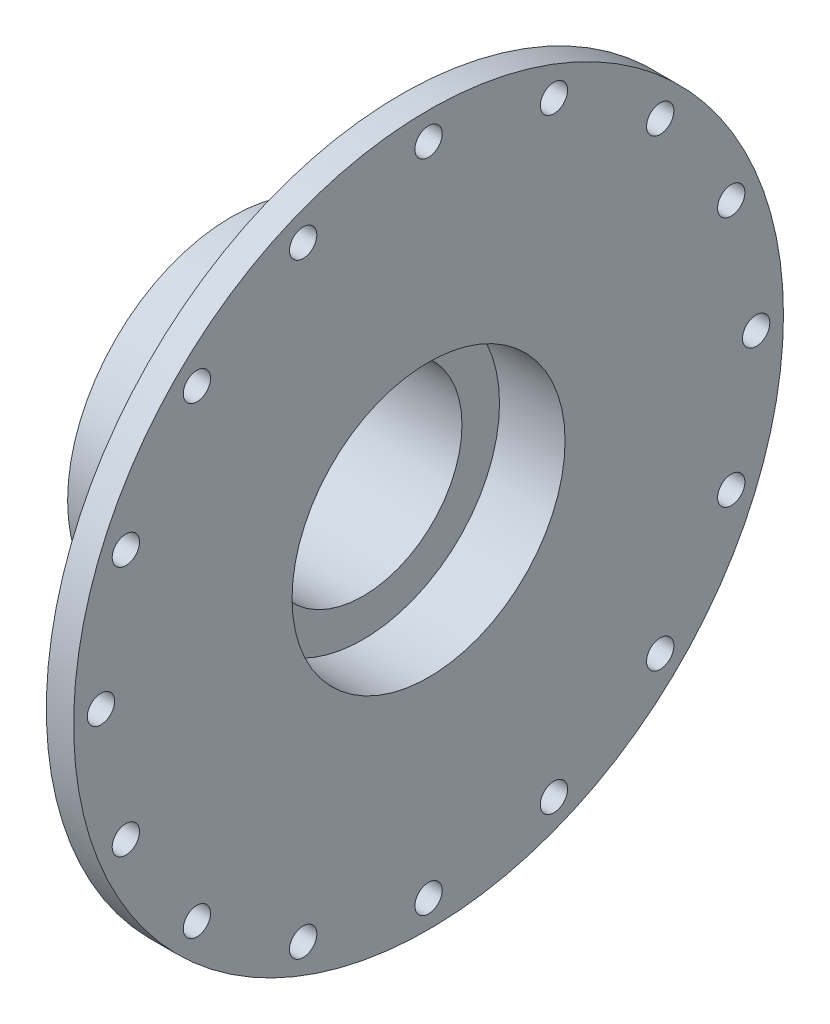
ISO-10303-21;
HEADER;
FILE_DESCRIPTION(('STEP AP214'),'2;1');
FILE_NAME('part.step','',(''),(''),'','','');
FILE_SCHEMA(('AUTOMOTIVE_DESIGN { 1 0 10303 214 1 1 1 1 }'));
ENDSEC;
DATA;
#1=APPLICATION_CONTEXT('core data for automotive mechanical design processes');
#2=APPLICATION_PROTOCOL_DEFINITION('international standard','automotive_design',2000,#1);
#3=PRODUCT_CONTEXT('',#1,'mechanical');
#4=PRODUCT('Part','Part','',(#3));
#5=PRODUCT_RELATED_PRODUCT_CATEGORY('part','',(#4));
#6=PRODUCT_DEFINITION_FORMATION('','',#4);
#7=PRODUCT_DEFINITION_CONTEXT('part definition',#1,'design');
#8=PRODUCT_DEFINITION('design','',#6,#7);
#9=PRODUCT_DEFINITION_SHAPE('','',#8);
#10=(LENGTH_UNIT() NAMED_UNIT(*) SI_UNIT(.MILLI.,.METRE.));
#11=(NAMED_UNIT(*) PLANE_ANGLE_UNIT() SI_UNIT($,.RADIAN.));
#12=(NAMED_UNIT(*) SI_UNIT($,.STERADIAN.) SOLID_ANGLE_UNIT());
#13=UNCERTAINTY_MEASURE_WITH_UNIT(LENGTH_MEASURE(1.E-05),#10,'distance_accuracy_value','');
#14=(GEOMETRIC_REPRESENTATION_CONTEXT(3) GLOBAL_UNCERTAINTY_ASSIGNED_CONTEXT((#13)) GLOBAL_UNIT_ASSIGNED_CONTEXT((#10,
#11,#12)) REPRESENTATION_CONTEXT('',''));
#15=CARTESIAN_POINT('',(0.,0.,0.));
#16=DIRECTION('',(0.,0.,1.));
#17=DIRECTION('',(1.,0.,0.));
#18=AXIS2_PLACEMENT_3D('',#15,#16,#17);
#19=CARTESIAN_POINT('',(10.,0.,0.));
#20=DIRECTION('',(-1.,0.,0.));
#21=DIRECTION('',(0.,0.,1.));
#22=AXIS2_PLACEMENT_3D('',#19,#20,#21);
#23=CYLINDRICAL_SURFACE('',#22,36.2419);
#24=CARTESIAN_POINT('',(-14.,0.,0.));
#25=DIRECTION('',(1.,0.,0.));
#26=DIRECTION('',(0.,0.,-1.));
#27=AXIS2_PLACEMENT_3D('',#24,#25,#26);
#28=CIRCLE('',#27,36.2419);
#29=CARTESIAN_POINT('',(-14.,0.,-36.2419));
#30=VERTEX_POINT('',#29);
#31=EDGE_CURVE('E35',#30,#30,#28,.T.);
#32=ORIENTED_EDGE('',*,*,#31,.T.);
#33=EDGE_LOOP('',(#32));
#34=FACE_BOUND('',#33,.T.);
#35=CARTESIAN_POINT('',(-62.2,0.,0.));
#36=DIRECTION('',(-1.,0.,0.));
#37=DIRECTION('',(0.,0.,1.));
#38=AXIS2_PLACEMENT_3D('',#35,#36,#37);
#39=CIRCLE('',#38,36.2419);
#40=CARTESIAN_POINT('',(-62.2,0.,36.2419));
#41=VERTEX_POINT('',#40);
#42=EDGE_CURVE('E156',#41,#41,#39,.T.);
#43=ORIENTED_EDGE('',*,*,#42,.T.);
#44=EDGE_LOOP('',(#43));
#45=FACE_BOUND('',#44,.T.);
#46=ADVANCED_FACE('F31',(#34,#45),#23,.F.);
#47=CARTESIAN_POINT('',(10.,0.,0.));
#48=DIRECTION('',(1.,0.,0.));
#49=DIRECTION('',(0.,0.,-1.));
#50=AXIS2_PLACEMENT_3D('',#47,#48,#49);
#51=PLANE('',#50);
#52=CARTESIAN_POINT('',(10.,0.,0.));
#53=DIRECTION('',(1.,0.,0.));
#54=DIRECTION('',(0.,0.,-1.));
#55=AXIS2_PLACEMENT_3D('',#52,#53,#54);
#56=CIRCLE('',#55,50.);
#57=CARTESIAN_POINT('',(10.,0.,-50.));
#58=VERTEX_POINT('',#57);
#59=EDGE_CURVE('E147',#58,#58,#56,.T.);
#60=ORIENTED_EDGE('',*,*,#59,.F.);
#61=EDGE_LOOP('',(#60));
#62=FACE_BOUND('',#61,.T.);
#63=CARTESIAN_POINT('',(10.,84.8528137423821,84.8528137423842));
#64=DIRECTION('',(1.,0.,0.));
#65=DIRECTION('',(0.,0.,-1.));
#66=AXIS2_PLACEMENT_3D('',#63,#64,#65);
#67=CIRCLE('',#66,5.0000000000039);
#68=CARTESIAN_POINT('',(10.,84.8528137423821,79.8528137423803));
#69=VERTEX_POINT('',#68);
#70=EDGE_CURVE('E133',#69,#69,#67,.T.);
#71=ORIENTED_EDGE('',*,*,#70,.F.);
#72=EDGE_LOOP('',(#71));
#73=FACE_BOUND('',#72,.T.);
#74=CARTESIAN_POINT('',(10.,-5.11590769747272E-12,119.999999999995));
#75=DIRECTION('',(1.,0.,0.));
#76=DIRECTION('',(0.,0.,-1.));
#77=AXIS2_PLACEMENT_3D('',#74,#75,#76);
#78=CIRCLE('',#77,5.00000000000759);
#79=CARTESIAN_POINT('',(10.,-5.11590769747272E-12,114.999999999987));
#80=VERTEX_POINT('',#79);
#81=EDGE_CURVE('E121',#80,#80,#78,.T.);
#82=ORIENTED_EDGE('',*,*,#81,.F.);
#83=EDGE_LOOP('',(#82));
#84=FACE_BOUND('',#83,.T.);
#85=CARTESIAN_POINT('',(10.,-84.8528137423893,84.852813742377));
#86=DIRECTION('',(1.,0.,0.));
#87=DIRECTION('',(0.,0.,-1.));
#88=AXIS2_PLACEMENT_3D('',#85,#86,#87);
#89=CIRCLE('',#88,5.00000000001042);
#90=CARTESIAN_POINT('',(10.,-84.8528137423893,79.8528137423666));
#91=VERTEX_POINT('',#90);
#92=EDGE_CURVE('E109',#91,#91,#89,.T.);
#93=ORIENTED_EDGE('',*,*,#92,.F.);
#94=EDGE_LOOP('',(#93));
#95=FACE_BOUND('',#94,.T.);
#96=CARTESIAN_POINT('',(10.,-120.,-1.02024238717659E-11));
#97=DIRECTION('',(1.,0.,0.));
#98=DIRECTION('',(0.,0.,-1.));
#99=AXIS2_PLACEMENT_3D('',#96,#97,#98);
#100=CIRCLE('',#99,5.00000000001056);
#101=CARTESIAN_POINT('',(10.,-120.,-5.00000000002077));
#102=VERTEX_POINT('',#101);
#103=EDGE_CURVE('E97',#102,#102,#100,.T.);
#104=ORIENTED_EDGE('',*,*,#103,.F.);
#105=EDGE_LOOP('',(#104));
#106=FACE_BOUND('',#105,.T.);
#107=CARTESIAN_POINT('',(10.,-84.8528137423821,-84.8528137423944));
#108=DIRECTION('',(1.,0.,0.));
#109=DIRECTION('',(0.,0.,-1.));
#110=AXIS2_PLACEMENT_3D('',#107,#108,#109);
#111=CIRCLE('',#110,5.0000000000079);
#112=CARTESIAN_POINT('',(10.,-84.8528137423821,-89.8528137424023));
#113=VERTEX_POINT('',#112);
#114=EDGE_CURVE('E85',#113,#113,#111,.T.);
#115=ORIENTED_EDGE('',*,*,#114,.F.);
#116=EDGE_LOOP('',(#115));
#117=FACE_BOUND('',#116,.T.);
#118=CARTESIAN_POINT('',(10.,5.10121193588295E-12,-120.000000000005));
#119=DIRECTION('',(1.,0.,0.));
#120=DIRECTION('',(0.,0.,-1.));
#121=AXIS2_PLACEMENT_3D('',#118,#119,#120);
#122=CIRCLE('',#121,5.00000000000379);
#123=CARTESIAN_POINT('',(10.,5.10121193588295E-12,-125.000000000009));
#124=VERTEX_POINT('',#123);
#125=EDGE_CURVE('E73',#124,#124,#122,.T.);
#126=ORIENTED_EDGE('',*,*,#125,.F.);
#127=EDGE_LOOP('',(#126));
#128=FACE_BOUND('',#127,.T.);
#129=CARTESIAN_POINT('',(10.,84.8528137423893,-84.8528137423872));
#130=DIRECTION('',(1.,0.,0.));
#131=DIRECTION('',(0.,0.,-1.));
#132=AXIS2_PLACEMENT_3D('',#129,#130,#131);
#133=CIRCLE('',#132,5.00000000000058);
#134=CARTESIAN_POINT('',(10.,84.8528137423893,-89.8528137423878));
#135=VERTEX_POINT('',#134);
#136=EDGE_CURVE('E61',#135,#135,#133,.T.);
#137=ORIENTED_EDGE('',*,*,#136,.F.);
#138=EDGE_LOOP('',(#137));
#139=FACE_BOUND('',#138,.T.);
#140=CARTESIAN_POINT('',(10.,0.,0.));
#141=DIRECTION('',(1.,0.,0.));
#142=DIRECTION('',(0.,0.,-1.));
#143=AXIS2_PLACEMENT_3D('',#140,#141,#142);
#144=CIRCLE('',#143,130.);
#145=CARTESIAN_POINT('',(10.,0.,-130.));
#146=VERTEX_POINT('',#145);
#147=EDGE_CURVE('E43',#146,#146,#144,.T.);
#148=ORIENTED_EDGE('',*,*,#147,.T.);
#149=EDGE_LOOP('',(#148));
#150=FACE_BOUND('',#149,.T.);
#151=CARTESIAN_POINT('',(10.,120.,0.));
#152=DIRECTION('',(1.,0.,0.));
#153=DIRECTION('',(0.,0.,-1.));
#154=AXIS2_PLACEMENT_3D('',#151,#152,#153);
#155=CIRCLE('',#154,5.);
#156=CARTESIAN_POINT('',(10.,120.,-5.));
#157=VERTEX_POINT('',#156);
#158=EDGE_CURVE('E49',#157,#157,#155,.T.);
#159=ORIENTED_EDGE('',*,*,#158,.F.);
#160=EDGE_LOOP('',(#159));
#161=FACE_BOUND('',#160,.T.);
#162=CARTESIAN_POINT('',(10.,110.865543901354,-45.9220118838109));
#163=DIRECTION('',(1.,0.,0.));
#164=DIRECTION('',(0.,0.,-1.));
#165=AXIS2_PLACEMENT_3D('',#162,#163,#164);
#166=CIRCLE('',#165,5.00000000000001);
#167=CARTESIAN_POINT('',(10.,110.865543901354,-50.9220118838109));
#168=VERTEX_POINT('',#167);
#169=EDGE_CURVE('E55',#168,#168,#166,.T.);
#170=ORIENTED_EDGE('',*,*,#169,.F.);
#171=EDGE_LOOP('',(#170));
#172=FACE_BOUND('',#171,.T.);
#173=CARTESIAN_POINT('',(10.,45.9220118838155,-110.865543901358));
#174=DIRECTION('',(1.,0.,0.));
#175=DIRECTION('',(0.,0.,-1.));
#176=AXIS2_PLACEMENT_3D('',#173,#174,#175);
#177=CIRCLE('',#176,5.00000000000195);
#178=CARTESIAN_POINT('',(10.,45.9220118838155,-115.86554390136));
#179=VERTEX_POINT('',#178);
#180=EDGE_CURVE('E67',#179,#179,#177,.T.);
#181=ORIENTED_EDGE('',*,*,#180,.F.);
#182=EDGE_LOOP('',(#181));
#183=FACE_BOUND('',#182,.T.);
#184=CARTESIAN_POINT('',(10.,-45.9220118838061,-110.865543901361));
#185=DIRECTION('',(1.,0.,0.));
#186=DIRECTION('',(0.,0.,-1.));
#187=AXIS2_PLACEMENT_3D('',#184,#185,#186);
#188=CIRCLE('',#187,5.00000000000586);
#189=CARTESIAN_POINT('',(10.,-45.9220118838061,-115.865543901367));
#190=VERTEX_POINT('',#189);
#191=EDGE_CURVE('E79',#190,#190,#188,.T.);
#192=ORIENTED_EDGE('',*,*,#191,.F.);
#193=EDGE_LOOP('',(#192));
#194=FACE_BOUND('',#193,.T.);
#195=CARTESIAN_POINT('',(10.,-110.865543901352,-45.9220118838206));
#196=DIRECTION('',(1.,0.,0.));
#197=DIRECTION('',(0.,0.,-1.));
#198=AXIS2_PLACEMENT_3D('',#195,#196,#197);
#199=CIRCLE('',#198,5.00000000000951);
#200=CARTESIAN_POINT('',(10.,-110.865543901352,-50.9220118838301));
#201=VERTEX_POINT('',#200);
#202=EDGE_CURVE('E91',#201,#201,#199,.T.);
#203=ORIENTED_EDGE('',*,*,#202,.F.);
#204=EDGE_LOOP('',(#203));
#205=FACE_BOUND('',#204,.T.);
#206=CARTESIAN_POINT('',(10.,-110.865543901356,45.922011883801));
#207=DIRECTION('',(1.,0.,0.));
#208=DIRECTION('',(0.,0.,-1.));
#209=AXIS2_PLACEMENT_3D('',#206,#207,#208);
#210=CIRCLE('',#209,5.00000000001086);
#211=CARTESIAN_POINT('',(10.,-110.865543901356,40.9220118837901));
#212=VERTEX_POINT('',#211);
#213=EDGE_CURVE('E103',#212,#212,#210,.T.);
#214=ORIENTED_EDGE('',*,*,#213,.F.);
#215=EDGE_LOOP('',(#214));
#216=FACE_BOUND('',#215,.T.);
#217=CARTESIAN_POINT('',(10.,-45.9220118838155,110.865543901347));
#218=DIRECTION('',(1.,0.,0.));
#219=DIRECTION('',(0.,0.,-1.));
#220=AXIS2_PLACEMENT_3D('',#217,#218,#219);
#221=CIRCLE('',#220,5.00000000000933);
#222=CARTESIAN_POINT('',(10.,-45.9220118838155,105.865543901338));
#223=VERTEX_POINT('',#222);
#224=EDGE_CURVE('E115',#223,#223,#221,.T.);
#225=ORIENTED_EDGE('',*,*,#224,.F.);
#226=EDGE_LOOP('',(#225));
#227=FACE_BOUND('',#226,.T.);
#228=CARTESIAN_POINT('',(10.,45.9220118838061,110.865543901351));
#229=DIRECTION('',(1.,0.,0.));
#230=DIRECTION('',(0.,0.,-1.));
#231=AXIS2_PLACEMENT_3D('',#228,#229,#230);
#232=CIRCLE('',#231,5.0000000000056);
#233=CARTESIAN_POINT('',(10.,45.9220118838061,105.865543901346));
#234=VERTEX_POINT('',#233);
#235=EDGE_CURVE('E127',#234,#234,#232,.T.);
#236=ORIENTED_EDGE('',*,*,#235,.F.);
#237=EDGE_LOOP('',(#236));
#238=FACE_BOUND('',#237,.T.);
#239=CARTESIAN_POINT('',(10.,110.865543901352,45.9220118838105));
#240=DIRECTION('',(1.,0.,0.));
#241=DIRECTION('',(0.,0.,-1.));
#242=AXIS2_PLACEMENT_3D('',#239,#240,#241);
#243=CIRCLE('',#242,5.00000000000256);
#244=CARTESIAN_POINT('',(10.,110.865543901352,40.9220118838079));
#245=VERTEX_POINT('',#244);
#246=EDGE_CURVE('E139',#245,#245,#243,.T.);
#247=ORIENTED_EDGE('',*,*,#246,.F.);
#248=EDGE_LOOP('',(#247));
#249=FACE_BOUND('',#248,.T.);
#250=ADVANCED_FACE('F174',(#62,#73,#84,#95,#106,#117,#128,#139,#150,#161,#172,#183,#194,#205,
#216,#227,#238,#249),#51,.T.);
#251=CARTESIAN_POINT('',(0.,0.,0.));
#252=DIRECTION('',(1.,0.,0.));
#253=DIRECTION('',(0.,0.,-1.));
#254=AXIS2_PLACEMENT_3D('',#251,#252,#253);
#255=PLANE('',#254);
#256=CARTESIAN_POINT('',(0.,0.,0.));
#257=DIRECTION('',(1.,0.,0.));
#258=DIRECTION('',(0.,0.,-1.));
#259=AXIS2_PLACEMENT_3D('',#256,#257,#258);
#260=CIRCLE('',#259,70.);
#261=CARTESIAN_POINT('',(0.,0.,-70.));
#262=VERTEX_POINT('',#261);
#263=EDGE_CURVE('E39',#262,#262,#260,.T.);
#264=ORIENTED_EDGE('',*,*,#263,.T.);
#265=EDGE_LOOP('',(#264));
#266=FACE_BOUND('',#265,.T.);
#267=CARTESIAN_POINT('',(0.,0.,0.));
#268=DIRECTION('',(1.,0.,0.));
#269=DIRECTION('',(0.,0.,-1.));
#270=AXIS2_PLACEMENT_3D('',#267,#268,#269);
#271=CIRCLE('',#270,130.);
#272=CARTESIAN_POINT('',(0.,0.,-130.));
#273=VERTEX_POINT('',#272);
#274=EDGE_CURVE('E46',#273,#273,#271,.T.);
#275=ORIENTED_EDGE('',*,*,#274,.F.);
#276=EDGE_LOOP('',(#275));
#277=FACE_BOUND('',#276,.T.);
#278=CARTESIAN_POINT('',(0.,120.,0.));
#279=DIRECTION('',(1.,0.,0.));
#280=DIRECTION('',(0.,0.,-1.));
#281=AXIS2_PLACEMENT_3D('',#278,#279,#280);
#282=CIRCLE('',#281,5.);
#283=CARTESIAN_POINT('',(0.,120.,-5.));
#284=VERTEX_POINT('',#283);
#285=EDGE_CURVE('E52',#284,#284,#282,.T.);
#286=ORIENTED_EDGE('',*,*,#285,.T.);
#287=EDGE_LOOP('',(#286));
#288=FACE_BOUND('',#287,.T.);
#289=CARTESIAN_POINT('',(0.,110.865543901354,-45.9220118838109));
#290=DIRECTION('',(1.,0.,0.));
#291=DIRECTION('',(0.,0.,-1.));
#292=AXIS2_PLACEMENT_3D('',#289,#290,#291);
#293=CIRCLE('',#292,5.00000000000001);
#294=CARTESIAN_POINT('',(0.,110.865543901354,-50.9220118838109));
#295=VERTEX_POINT('',#294);
#296=EDGE_CURVE('E58',#295,#295,#293,.T.);
#297=ORIENTED_EDGE('',*,*,#296,.T.);
#298=EDGE_LOOP('',(#297));
#299=FACE_BOUND('',#298,.T.);
#300=CARTESIAN_POINT('',(0.,84.8528137423893,-84.8528137423872));
#301=DIRECTION('',(1.,0.,0.));
#302=DIRECTION('',(0.,0.,-1.));
#303=AXIS2_PLACEMENT_3D('',#300,#301,#302);
#304=CIRCLE('',#303,5.00000000000058);
#305=CARTESIAN_POINT('',(0.,84.8528137423893,-89.8528137423878));
#306=VERTEX_POINT('',#305);
#307=EDGE_CURVE('E64',#306,#306,#304,.T.);
#308=ORIENTED_EDGE('',*,*,#307,.T.);
#309=EDGE_LOOP('',(#308));
#310=FACE_BOUND('',#309,.T.);
#311=CARTESIAN_POINT('',(0.,45.9220118838155,-110.865543901358));
#312=DIRECTION('',(1.,0.,0.));
#313=DIRECTION('',(0.,0.,-1.));
#314=AXIS2_PLACEMENT_3D('',#311,#312,#313);
#315=CIRCLE('',#314,5.00000000000195);
#316=CARTESIAN_POINT('',(0.,45.9220118838155,-115.86554390136));
#317=VERTEX_POINT('',#316);
#318=EDGE_CURVE('E70',#317,#317,#315,.T.);
#319=ORIENTED_EDGE('',*,*,#318,.T.);
#320=EDGE_LOOP('',(#319));
#321=FACE_BOUND('',#320,.T.);
#322=CARTESIAN_POINT('',(0.,5.10121193588295E-12,-120.000000000005));
#323=DIRECTION('',(1.,0.,0.));
#324=DIRECTION('',(0.,0.,-1.));
#325=AXIS2_PLACEMENT_3D('',#322,#323,#324);
#326=CIRCLE('',#325,5.00000000000379);
#327=CARTESIAN_POINT('',(0.,5.10121193588295E-12,-125.000000000009));
#328=VERTEX_POINT('',#327);
#329=EDGE_CURVE('E76',#328,#328,#326,.T.);
#330=ORIENTED_EDGE('',*,*,#329,.T.);
#331=EDGE_LOOP('',(#330));
#332=FACE_BOUND('',#331,.T.);
#333=CARTESIAN_POINT('',(0.,-45.9220118838061,-110.865543901361));
#334=DIRECTION('',(1.,0.,0.));
#335=DIRECTION('',(0.,0.,-1.));
#336=AXIS2_PLACEMENT_3D('',#333,#334,#335);
#337=CIRCLE('',#336,5.00000000000586);
#338=CARTESIAN_POINT('',(0.,-45.9220118838061,-115.865543901367));
#339=VERTEX_POINT('',#338);
#340=EDGE_CURVE('E82',#339,#339,#337,.T.);
#341=ORIENTED_EDGE('',*,*,#340,.T.);
#342=EDGE_LOOP('',(#341));
#343=FACE_BOUND('',#342,.T.);
#344=CARTESIAN_POINT('',(0.,-84.8528137423821,-84.8528137423944));
#345=DIRECTION('',(1.,0.,0.));
#346=DIRECTION('',(0.,0.,-1.));
#347=AXIS2_PLACEMENT_3D('',#344,#345,#346);
#348=CIRCLE('',#347,5.0000000000079);
#349=CARTESIAN_POINT('',(0.,-84.8528137423821,-89.8528137424023));
#350=VERTEX_POINT('',#349);
#351=EDGE_CURVE('E88',#350,#350,#348,.T.);
#352=ORIENTED_EDGE('',*,*,#351,.T.);
#353=EDGE_LOOP('',(#352));
#354=FACE_BOUND('',#353,.T.);
#355=CARTESIAN_POINT('',(0.,-110.865543901352,-45.9220118838206));
#356=DIRECTION('',(1.,0.,0.));
#357=DIRECTION('',(0.,0.,-1.));
#358=AXIS2_PLACEMENT_3D('',#355,#356,#357);
#359=CIRCLE('',#358,5.00000000000951);
#360=CARTESIAN_POINT('',(0.,-110.865543901352,-50.9220118838301));
#361=VERTEX_POINT('',#360);
#362=EDGE_CURVE('E94',#361,#361,#359,.T.);
#363=ORIENTED_EDGE('',*,*,#362,.T.);
#364=EDGE_LOOP('',(#363));
#365=FACE_BOUND('',#364,.T.);
#366=CARTESIAN_POINT('',(0.,-120.,-1.02024238717659E-11));
#367=DIRECTION('',(1.,0.,0.));
#368=DIRECTION('',(0.,0.,-1.));
#369=AXIS2_PLACEMENT_3D('',#366,#367,#368);
#370=CIRCLE('',#369,5.00000000001056);
#371=CARTESIAN_POINT('',(0.,-120.,-5.00000000002077));
#372=VERTEX_POINT('',#371);
#373=EDGE_CURVE('E100',#372,#372,#370,.T.);
#374=ORIENTED_EDGE('',*,*,#373,.T.);
#375=EDGE_LOOP('',(#374));
#376=FACE_BOUND('',#375,.T.);
#377=CARTESIAN_POINT('',(0.,-110.865543901356,45.922011883801));
#378=DIRECTION('',(1.,0.,0.));
#379=DIRECTION('',(0.,0.,-1.));
#380=AXIS2_PLACEMENT_3D('',#377,#378,#379);
#381=CIRCLE('',#380,5.00000000001086);
#382=CARTESIAN_POINT('',(0.,-110.865543901356,40.9220118837901));
#383=VERTEX_POINT('',#382);
#384=EDGE_CURVE('E106',#383,#383,#381,.T.);
#385=ORIENTED_EDGE('',*,*,#384,.T.);
#386=EDGE_LOOP('',(#385));
#387=FACE_BOUND('',#386,.T.);
#388=CARTESIAN_POINT('',(0.,-84.8528137423893,84.852813742377));
#389=DIRECTION('',(1.,0.,0.));
#390=DIRECTION('',(0.,0.,-1.));
#391=AXIS2_PLACEMENT_3D('',#388,#389,#390);
#392=CIRCLE('',#391,5.00000000001042);
#393=CARTESIAN_POINT('',(0.,-84.8528137423893,79.8528137423666));
#394=VERTEX_POINT('',#393);
#395=EDGE_CURVE('E112',#394,#394,#392,.T.);
#396=ORIENTED_EDGE('',*,*,#395,.T.);
#397=EDGE_LOOP('',(#396));
#398=FACE_BOUND('',#397,.T.);
#399=CARTESIAN_POINT('',(0.,-45.9220118838155,110.865543901347));
#400=DIRECTION('',(1.,0.,0.));
#401=DIRECTION('',(0.,0.,-1.));
#402=AXIS2_PLACEMENT_3D('',#399,#400,#401);
#403=CIRCLE('',#402,5.00000000000933);
#404=CARTESIAN_POINT('',(0.,-45.9220118838155,105.865543901338));
#405=VERTEX_POINT('',#404);
#406=EDGE_CURVE('E118',#405,#405,#403,.T.);
#407=ORIENTED_EDGE('',*,*,#406,.T.);
#408=EDGE_LOOP('',(#407));
#409=FACE_BOUND('',#408,.T.);
#410=CARTESIAN_POINT('',(0.,-5.11590769747272E-12,119.999999999995));
#411=DIRECTION('',(1.,0.,0.));
#412=DIRECTION('',(0.,0.,-1.));
#413=AXIS2_PLACEMENT_3D('',#410,#411,#412);
#414=CIRCLE('',#413,5.00000000000759);
#415=CARTESIAN_POINT('',(0.,-5.11590769747272E-12,114.999999999987));
#416=VERTEX_POINT('',#415);
#417=EDGE_CURVE('E124',#416,#416,#414,.T.);
#418=ORIENTED_EDGE('',*,*,#417,.T.);
#419=EDGE_LOOP('',(#418));
#420=FACE_BOUND('',#419,.T.);
#421=CARTESIAN_POINT('',(0.,45.9220118838061,110.865543901351));
#422=DIRECTION('',(1.,0.,0.));
#423=DIRECTION('',(0.,0.,-1.));
#424=AXIS2_PLACEMENT_3D('',#421,#422,#423);
#425=CIRCLE('',#424,5.0000000000056);
#426=CARTESIAN_POINT('',(0.,45.9220118838061,105.865543901346));
#427=VERTEX_POINT('',#426);
#428=EDGE_CURVE('E130',#427,#427,#425,.T.);
#429=ORIENTED_EDGE('',*,*,#428,.T.);
#430=EDGE_LOOP('',(#429));
#431=FACE_BOUND('',#430,.T.);
#432=CARTESIAN_POINT('',(0.,84.8528137423821,84.8528137423842));
#433=DIRECTION('',(1.,0.,0.));
#434=DIRECTION('',(0.,0.,-1.));
#435=AXIS2_PLACEMENT_3D('',#432,#433,#434);
#436=CIRCLE('',#435,5.0000000000039);
#437=CARTESIAN_POINT('',(0.,84.8528137423821,79.8528137423803));
#438=VERTEX_POINT('',#437);
#439=EDGE_CURVE('E136',#438,#438,#436,.T.);
#440=ORIENTED_EDGE('',*,*,#439,.T.);
#441=EDGE_LOOP('',(#440));
#442=FACE_BOUND('',#441,.T.);
#443=CARTESIAN_POINT('',(0.,110.865543901352,45.9220118838105));
#444=DIRECTION('',(1.,0.,0.));
#445=DIRECTION('',(0.,0.,-1.));
#446=AXIS2_PLACEMENT_3D('',#443,#444,#445);
#447=CIRCLE('',#446,5.00000000000256);
#448=CARTESIAN_POINT('',(0.,110.865543901352,40.9220118838079));
#449=VERTEX_POINT('',#448);
#450=EDGE_CURVE('E142',#449,#449,#447,.T.);
#451=ORIENTED_EDGE('',*,*,#450,.T.);
#452=EDGE_LOOP('',(#451));
#453=FACE_BOUND('',#452,.T.);
#454=ADVANCED_FACE('F180',(#266,#277,#288,#299,#310,#321,#332,#343,#354,#365,#376,#387,#398,
#409,#420,#431,#442,#453),#255,.F.);
#455=CARTESIAN_POINT('',(10.,0.,0.));
#456=DIRECTION('',(-1.,0.,0.));
#457=DIRECTION('',(0.,0.,1.));
#458=AXIS2_PLACEMENT_3D('',#455,#456,#457);
#459=CYLINDRICAL_SURFACE('',#458,130.);
#460=ORIENTED_EDGE('',*,*,#147,.F.);
#461=EDGE_LOOP('',(#460));
#462=FACE_BOUND('',#461,.T.);
#463=ORIENTED_EDGE('',*,*,#274,.T.);
#464=EDGE_LOOP('',(#463));
#465=FACE_BOUND('',#464,.T.);
#466=ADVANCED_FACE('F190',(#462,#465),#459,.T.);
#467=CARTESIAN_POINT('',(10.,120.,0.));
#468=DIRECTION('',(-1.,0.,0.));
#469=DIRECTION('',(0.,0.,1.));
#470=AXIS2_PLACEMENT_3D('',#467,#468,#469);
#471=CYLINDRICAL_SURFACE('',#470,5.);
#472=ORIENTED_EDGE('',*,*,#158,.T.);
#473=EDGE_LOOP('',(#472));
#474=FACE_BOUND('',#473,.T.);
#475=ORIENTED_EDGE('',*,*,#285,.F.);
#476=EDGE_LOOP('',(#475));
#477=FACE_BOUND('',#476,.T.);
#478=ADVANCED_FACE('F188',(#474,#477),#471,.F.);
#479=CARTESIAN_POINT('',(10.,110.865543901354,-45.9220118838109));
#480=DIRECTION('',(-1.,0.,0.));
#481=DIRECTION('',(0.,0.,1.));
#482=AXIS2_PLACEMENT_3D('',#479,#480,#481);
#483=CYLINDRICAL_SURFACE('',#482,5.00000000000001);
#484=ORIENTED_EDGE('',*,*,#169,.T.);
#485=EDGE_LOOP('',(#484));
#486=FACE_BOUND('',#485,.T.);
#487=ORIENTED_EDGE('',*,*,#296,.F.);
#488=EDGE_LOOP('',(#487));
#489=FACE_BOUND('',#488,.T.);
#490=ADVANCED_FACE('F186',(#486,#489),#483,.F.);
#491=CARTESIAN_POINT('',(10.,84.8528137423893,-84.8528137423872));
#492=DIRECTION('',(-1.,0.,0.));
#493=DIRECTION('',(0.,0.,1.));
#494=AXIS2_PLACEMENT_3D('',#491,#492,#493);
#495=CYLINDRICAL_SURFACE('',#494,5.00000000000058);
#496=ORIENTED_EDGE('',*,*,#136,.T.);
#497=EDGE_LOOP('',(#496));
#498=FACE_BOUND('',#497,.T.);
#499=ORIENTED_EDGE('',*,*,#307,.F.);
#500=EDGE_LOOP('',(#499));
#501=FACE_BOUND('',#500,.T.);
#502=ADVANCED_FACE('F293',(#498,#501),#495,.F.);
#503=CARTESIAN_POINT('',(10.,45.9220118838155,-110.865543901358));
#504=DIRECTION('',(-1.,0.,0.));
#505=DIRECTION('',(0.,0.,1.));
#506=AXIS2_PLACEMENT_3D('',#503,#504,#505);
#507=CYLINDRICAL_SURFACE('',#506,5.00000000000195);
#508=ORIENTED_EDGE('',*,*,#180,.T.);
#509=EDGE_LOOP('',(#508));
#510=FACE_BOUND('',#509,.T.);
#511=ORIENTED_EDGE('',*,*,#318,.F.);
#512=EDGE_LOOP('',(#511));
#513=FACE_BOUND('',#512,.T.);
#514=ADVANCED_FACE('F290',(#510,#513),#507,.F.);
#515=CARTESIAN_POINT('',(10.,5.10121193588295E-12,-120.000000000005));
#516=DIRECTION('',(-1.,0.,0.));
#517=DIRECTION('',(0.,0.,1.));
#518=AXIS2_PLACEMENT_3D('',#515,#516,#517);
#519=CYLINDRICAL_SURFACE('',#518,5.00000000000379);
#520=ORIENTED_EDGE('',*,*,#125,.T.);
#521=EDGE_LOOP('',(#520));
#522=FACE_BOUND('',#521,.T.);
#523=ORIENTED_EDGE('',*,*,#329,.F.);
#524=EDGE_LOOP('',(#523));
#525=FACE_BOUND('',#524,.T.);
#526=ADVANCED_FACE('F286',(#522,#525),#519,.F.);
#527=CARTESIAN_POINT('',(10.,-45.9220118838061,-110.865543901361));
#528=DIRECTION('',(-1.,0.,0.));
#529=DIRECTION('',(0.,0.,1.));
#530=AXIS2_PLACEMENT_3D('',#527,#528,#529);
#531=CYLINDRICAL_SURFACE('',#530,5.00000000000586);
#532=ORIENTED_EDGE('',*,*,#191,.T.);
#533=EDGE_LOOP('',(#532));
#534=FACE_BOUND('',#533,.T.);
#535=ORIENTED_EDGE('',*,*,#340,.F.);
#536=EDGE_LOOP('',(#535));
#537=FACE_BOUND('',#536,.T.);
#538=ADVANCED_FACE('F282',(#534,#537),#531,.F.);
#539=CARTESIAN_POINT('',(10.,-84.8528137423821,-84.8528137423944));
#540=DIRECTION('',(-1.,0.,0.));
#541=DIRECTION('',(0.,0.,1.));
#542=AXIS2_PLACEMENT_3D('',#539,#540,#541);
#543=CYLINDRICAL_SURFACE('',#542,5.0000000000079);
#544=ORIENTED_EDGE('',*,*,#114,.T.);
#545=EDGE_LOOP('',(#544));
#546=FACE_BOUND('',#545,.T.);
#547=ORIENTED_EDGE('',*,*,#351,.F.);
#548=EDGE_LOOP('',(#547));
#549=FACE_BOUND('',#548,.T.);
#550=ADVANCED_FACE('F278',(#546,#549),#543,.F.);
#551=CARTESIAN_POINT('',(10.,-110.865543901352,-45.9220118838206));
#552=DIRECTION('',(-1.,0.,0.));
#553=DIRECTION('',(0.,0.,1.));
#554=AXIS2_PLACEMENT_3D('',#551,#552,#553);
#555=CYLINDRICAL_SURFACE('',#554,5.00000000000951);
#556=ORIENTED_EDGE('',*,*,#202,.T.);
#557=EDGE_LOOP('',(#556));
#558=FACE_BOUND('',#557,.T.);
#559=ORIENTED_EDGE('',*,*,#362,.F.);
#560=EDGE_LOOP('',(#559));
#561=FACE_BOUND('',#560,.T.);
#562=ADVANCED_FACE('F274',(#558,#561),#555,.F.);
#563=CARTESIAN_POINT('',(10.,-120.,-1.02024238717659E-11));
#564=DIRECTION('',(-1.,0.,0.));
#565=DIRECTION('',(0.,0.,1.));
#566=AXIS2_PLACEMENT_3D('',#563,#564,#565);
#567=CYLINDRICAL_SURFACE('',#566,5.00000000001056);
#568=ORIENTED_EDGE('',*,*,#103,.T.);
#569=EDGE_LOOP('',(#568));
#570=FACE_BOUND('',#569,.T.);
#571=ORIENTED_EDGE('',*,*,#373,.F.);
#572=EDGE_LOOP('',(#571));
#573=FACE_BOUND('',#572,.T.);
#574=ADVANCED_FACE('F270',(#570,#573),#567,.F.);
#575=CARTESIAN_POINT('',(10.,-110.865543901356,45.922011883801));
#576=DIRECTION('',(-1.,0.,0.));
#577=DIRECTION('',(0.,0.,1.));
#578=AXIS2_PLACEMENT_3D('',#575,#576,#577);
#579=CYLINDRICAL_SURFACE('',#578,5.00000000001086);
#580=ORIENTED_EDGE('',*,*,#213,.T.);
#581=EDGE_LOOP('',(#580));
#582=FACE_BOUND('',#581,.T.);
#583=ORIENTED_EDGE('',*,*,#384,.F.);
#584=EDGE_LOOP('',(#583));
#585=FACE_BOUND('',#584,.T.);
#586=ADVANCED_FACE('F266',(#582,#585),#579,.F.);
#587=CARTESIAN_POINT('',(10.,-84.8528137423893,84.852813742377));
#588=DIRECTION('',(-1.,0.,0.));
#589=DIRECTION('',(0.,0.,1.));
#590=AXIS2_PLACEMENT_3D('',#587,#588,#589);
#591=CYLINDRICAL_SURFACE('',#590,5.00000000001042);
#592=ORIENTED_EDGE('',*,*,#92,.T.);
#593=EDGE_LOOP('',(#592));
#594=FACE_BOUND('',#593,.T.);
#595=ORIENTED_EDGE('',*,*,#395,.F.);
#596=EDGE_LOOP('',(#595));
#597=FACE_BOUND('',#596,.T.);
#598=ADVANCED_FACE('F262',(#594,#597),#591,.F.);
#599=CARTESIAN_POINT('',(10.,-45.9220118838155,110.865543901347));
#600=DIRECTION('',(-1.,0.,0.));
#601=DIRECTION('',(0.,0.,1.));
#602=AXIS2_PLACEMENT_3D('',#599,#600,#601);
#603=CYLINDRICAL_SURFACE('',#602,5.00000000000933);
#604=ORIENTED_EDGE('',*,*,#224,.T.);
#605=EDGE_LOOP('',(#604));
#606=FACE_BOUND('',#605,.T.);
#607=ORIENTED_EDGE('',*,*,#406,.F.);
#608=EDGE_LOOP('',(#607));
#609=FACE_BOUND('',#608,.T.);
#610=ADVANCED_FACE('F258',(#606,#609),#603,.F.);
#611=CARTESIAN_POINT('',(10.,-5.11590769747272E-12,119.999999999995));
#612=DIRECTION('',(-1.,0.,0.));
#613=DIRECTION('',(0.,0.,1.));
#614=AXIS2_PLACEMENT_3D('',#611,#612,#613);
#615=CYLINDRICAL_SURFACE('',#614,5.00000000000759);
#616=ORIENTED_EDGE('',*,*,#81,.T.);
#617=EDGE_LOOP('',(#616));
#618=FACE_BOUND('',#617,.T.);
#619=ORIENTED_EDGE('',*,*,#417,.F.);
#620=EDGE_LOOP('',(#619));
#621=FACE_BOUND('',#620,.T.);
#622=ADVANCED_FACE('F254',(#618,#621),#615,.F.);
#623=CARTESIAN_POINT('',(10.,45.9220118838061,110.865543901351));
#624=DIRECTION('',(-1.,0.,0.));
#625=DIRECTION('',(0.,0.,1.));
#626=AXIS2_PLACEMENT_3D('',#623,#624,#625);
#627=CYLINDRICAL_SURFACE('',#626,5.0000000000056);
#628=ORIENTED_EDGE('',*,*,#235,.T.);
#629=EDGE_LOOP('',(#628));
#630=FACE_BOUND('',#629,.T.);
#631=ORIENTED_EDGE('',*,*,#428,.F.);
#632=EDGE_LOOP('',(#631));
#633=FACE_BOUND('',#632,.T.);
#634=ADVANCED_FACE('F247',(#630,#633),#627,.F.);
#635=CARTESIAN_POINT('',(10.,84.8528137423821,84.8528137423842));
#636=DIRECTION('',(-1.,0.,0.));
#637=DIRECTION('',(0.,0.,1.));
#638=AXIS2_PLACEMENT_3D('',#635,#636,#637);
#639=CYLINDRICAL_SURFACE('',#638,5.0000000000039);
#640=ORIENTED_EDGE('',*,*,#70,.T.);
#641=EDGE_LOOP('',(#640));
#642=FACE_BOUND('',#641,.T.);
#643=ORIENTED_EDGE('',*,*,#439,.F.);
#644=EDGE_LOOP('',(#643));
#645=FACE_BOUND('',#644,.T.);
#646=ADVANCED_FACE('F239',(#642,#645),#639,.F.);
#647=CARTESIAN_POINT('',(10.,110.865543901352,45.9220118838105));
#648=DIRECTION('',(-1.,0.,0.));
#649=DIRECTION('',(0.,0.,1.));
#650=AXIS2_PLACEMENT_3D('',#647,#648,#649);
#651=CYLINDRICAL_SURFACE('',#650,5.00000000000256);
#652=ORIENTED_EDGE('',*,*,#246,.T.);
#653=EDGE_LOOP('',(#652));
#654=FACE_BOUND('',#653,.T.);
#655=ORIENTED_EDGE('',*,*,#450,.F.);
#656=EDGE_LOOP('',(#655));
#657=FACE_BOUND('',#656,.T.);
#658=ADVANCED_FACE('F236',(#654,#657),#651,.F.);
#659=CARTESIAN_POINT('',(-40.,0.,0.));
#660=DIRECTION('',(1.,0.,0.));
#661=DIRECTION('',(0.,0.,-1.));
#662=AXIS2_PLACEMENT_3D('',#659,#660,#661);
#663=CYLINDRICAL_SURFACE('',#662,60.);
#664=CARTESIAN_POINT('',(-10.,0.,0.));
#665=DIRECTION('',(1.,0.,0.));
#666=DIRECTION('',(0.,0.,-1.));
#667=AXIS2_PLACEMENT_3D('',#664,#665,#666);
#668=CIRCLE('',#667,60.);
#669=CARTESIAN_POINT('',(-10.,0.,-60.));
#670=VERTEX_POINT('',#669);
#671=EDGE_CURVE('E10',#670,#670,#668,.F.);
#672=ORIENTED_EDGE('',*,*,#671,.T.);
#673=EDGE_LOOP('',(#672));
#674=FACE_BOUND('',#673,.T.);
#675=CARTESIAN_POINT('',(-62.2,0.,0.));
#676=DIRECTION('',(-1.,0.,0.));
#677=DIRECTION('',(0.,0.,1.));
#678=AXIS2_PLACEMENT_3D('',#675,#676,#677);
#679=CIRCLE('',#678,60.);
#680=CARTESIAN_POINT('',(-62.2,0.,60.));
#681=VERTEX_POINT('',#680);
#682=EDGE_CURVE('E151',#681,#681,#679,.T.);
#683=ORIENTED_EDGE('',*,*,#682,.F.);
#684=EDGE_LOOP('',(#683));
#685=FACE_BOUND('',#684,.T.);
#686=ADVANCED_FACE('F238',(#674,#685),#663,.T.);
#687=CARTESIAN_POINT('',(-10.,0.,0.));
#688=DIRECTION('',(1.,0.,0.));
#689=DIRECTION('',(0.,0.,-1.));
#690=AXIS2_PLACEMENT_3D('',#687,#688,#689);
#691=TOROIDAL_SURFACE('',#690,70.,10.);
#692=ORIENTED_EDGE('',*,*,#671,.F.);
#693=EDGE_LOOP('',(#692));
#694=FACE_BOUND('',#693,.T.);
#695=ORIENTED_EDGE('',*,*,#263,.F.);
#696=EDGE_LOOP('',(#695));
#697=FACE_BOUND('',#696,.T.);
#698=ADVANCED_FACE('F33',(#694,#697),#691,.F.);
#699=CARTESIAN_POINT('',(-14.,0.,0.));
#700=DIRECTION('',(1.,0.,0.));
#701=DIRECTION('',(0.,0.,-1.));
#702=AXIS2_PLACEMENT_3D('',#699,#700,#701);
#703=CYLINDRICAL_SURFACE('',#702,50.);
#704=CARTESIAN_POINT('',(-14.,0.,0.));
#705=DIRECTION('',(1.,0.,0.));
#706=DIRECTION('',(0.,0.,-1.));
#707=AXIS2_PLACEMENT_3D('',#704,#705,#706);
#708=CIRCLE('',#707,50.);
#709=CARTESIAN_POINT('',(-14.,0.,-50.));
#710=VERTEX_POINT('',#709);
#711=EDGE_CURVE('E150',#710,#710,#708,.T.);
#712=ORIENTED_EDGE('',*,*,#711,.F.);
#713=EDGE_LOOP('',(#712));
#714=FACE_BOUND('',#713,.T.);
#715=ORIENTED_EDGE('',*,*,#59,.T.);
#716=EDGE_LOOP('',(#715));
#717=FACE_BOUND('',#716,.T.);
#718=ADVANCED_FACE('F170',(#714,#717),#703,.F.);
#719=CARTESIAN_POINT('',(-14.,0.,0.));
#720=DIRECTION('',(1.,0.,0.));
#721=DIRECTION('',(0.,0.,-1.));
#722=AXIS2_PLACEMENT_3D('',#719,#720,#721);
#723=PLANE('',#722);
#724=ORIENTED_EDGE('',*,*,#31,.F.);
#725=EDGE_LOOP('',(#724));
#726=FACE_BOUND('',#725,.T.);
#727=ORIENTED_EDGE('',*,*,#711,.T.);
#728=EDGE_LOOP('',(#727));
#729=FACE_BOUND('',#728,.T.);
#730=ADVANCED_FACE('F163',(#726,#729),#723,.T.);
#731=CARTESIAN_POINT('',(-62.2,0.,0.));
#732=DIRECTION('',(-1.,0.,0.));
#733=DIRECTION('',(0.,0.,1.));
#734=AXIS2_PLACEMENT_3D('',#731,#732,#733);
#735=PLANE('',#734);
#736=ORIENTED_EDGE('',*,*,#682,.T.);
#737=EDGE_LOOP('',(#736));
#738=FACE_BOUND('',#737,.T.);
#739=ORIENTED_EDGE('',*,*,#42,.F.);
#740=EDGE_LOOP('',(#739));
#741=FACE_BOUND('',#740,.T.);
#742=ADVANCED_FACE('F161',(#738,#741),#735,.T.);
#743=CLOSED_SHELL('',(#46,#250,#454,#466,#478,#490,#502,#514,#526,#538,#550,#562,#574,#586,#598,
#610,#622,#634,#646,#658,#686,#698,#718,#730,#742));
#744=MANIFOLD_SOLID_BREP('B2',#743);
#745=ADVANCED_BREP_SHAPE_REPRESENTATION('',(#18,#744),#14);
#746=SHAPE_DEFINITION_REPRESENTATION(#9,#745);
ENDSEC;
END-ISO-10303-21;
